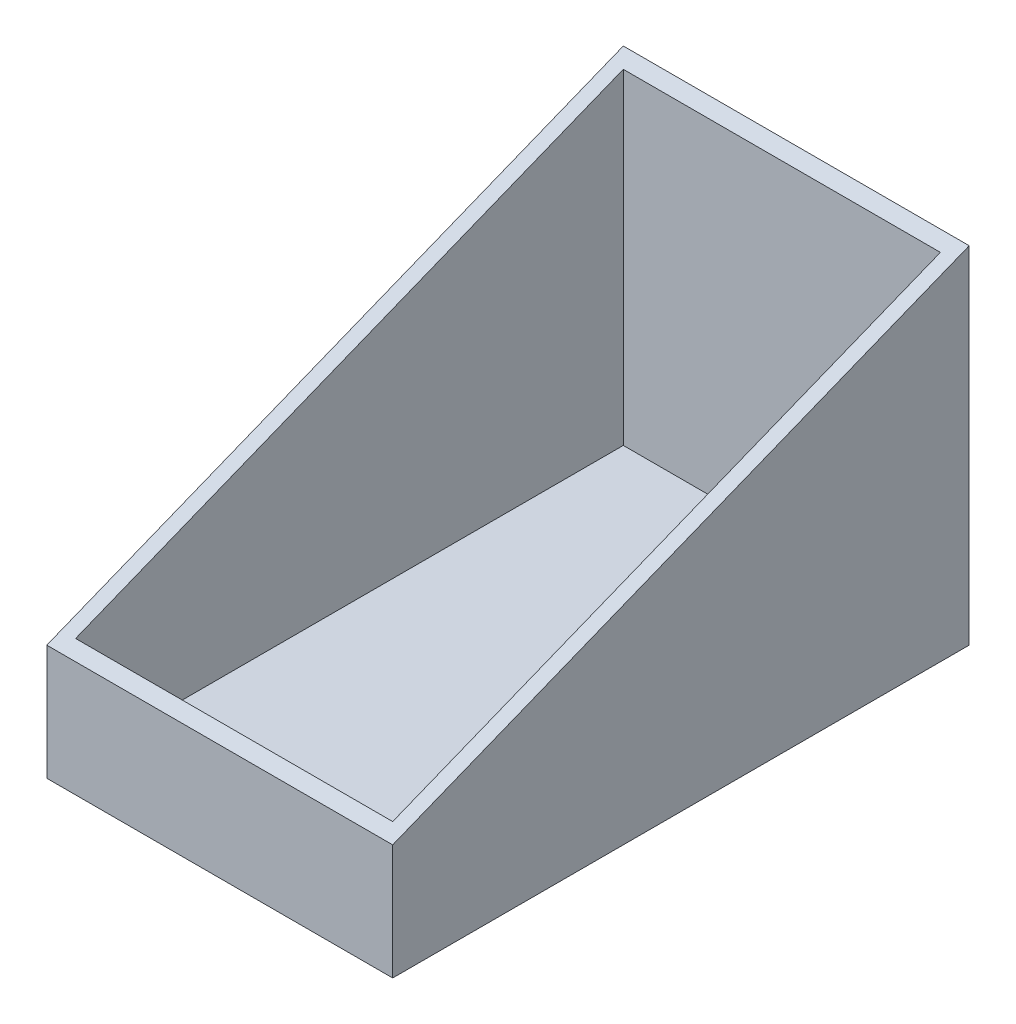
ISO-10303-21;
HEADER;
FILE_DESCRIPTION(('STEP AP214'),'2;1');
FILE_NAME('part.step','',(''),(''),'','','');
FILE_SCHEMA(('AUTOMOTIVE_DESIGN { 1 0 10303 214 1 1 1 1 }'));
ENDSEC;
DATA;
#1=APPLICATION_CONTEXT('core data for automotive mechanical design processes');
#2=APPLICATION_PROTOCOL_DEFINITION('international standard','automotive_design',2000,#1);
#3=PRODUCT_CONTEXT('',#1,'mechanical');
#4=PRODUCT('Part','Part','',(#3));
#5=PRODUCT_RELATED_PRODUCT_CATEGORY('part','',(#4));
#6=PRODUCT_DEFINITION_FORMATION('','',#4);
#7=PRODUCT_DEFINITION_CONTEXT('part definition',#1,'design');
#8=PRODUCT_DEFINITION('design','',#6,#7);
#9=PRODUCT_DEFINITION_SHAPE('','',#8);
#10=(LENGTH_UNIT() NAMED_UNIT(*) SI_UNIT(.MILLI.,.METRE.));
#11=(NAMED_UNIT(*) PLANE_ANGLE_UNIT() SI_UNIT($,.RADIAN.));
#12=(NAMED_UNIT(*) SI_UNIT($,.STERADIAN.) SOLID_ANGLE_UNIT());
#13=UNCERTAINTY_MEASURE_WITH_UNIT(LENGTH_MEASURE(1.E-05),#10,'distance_accuracy_value','');
#14=(GEOMETRIC_REPRESENTATION_CONTEXT(3) GLOBAL_UNCERTAINTY_ASSIGNED_CONTEXT((#13)) GLOBAL_UNIT_ASSIGNED_CONTEXT((#10,
#11,#12)) REPRESENTATION_CONTEXT('',''));
#15=CARTESIAN_POINT('',(0.,0.,0.));
#16=DIRECTION('',(0.,0.,1.));
#17=DIRECTION('',(1.,0.,0.));
#18=AXIS2_PLACEMENT_3D('',#15,#16,#17);
#19=CARTESIAN_POINT('',(152.4,43.7931034482759,17.5172413793103));
#20=DIRECTION('',(0.,-0.928476690885259,-0.371390676354104));
#21=DIRECTION('',(0.,0.371390676354104,-0.928476690885259));
#22=AXIS2_PLACEMENT_3D('',#19,#20,#21);
#23=PLANE('',#22);
#24=DIRECTION('',(0.,-0.371390676354104,0.928476690885259));
#25=VECTOR('',#24,1.);
#26=CARTESIAN_POINT('',(0.,43.7931034482759,17.5172413793103));
#27=LINE('',#26,#25);
#28=CARTESIAN_POINT('',(0.,152.4,-254.));
#29=VERTEX_POINT('',#28);
#30=CARTESIAN_POINT('',(0.,50.8,0.));
#31=VERTEX_POINT('',#30);
#32=EDGE_CURVE('E183',#29,#31,#27,.T.);
#33=ORIENTED_EDGE('',*,*,#32,.T.);
#34=DIRECTION('',(-1.,0.,0.));
#35=VECTOR('',#34,1.);
#36=CARTESIAN_POINT('',(152.4,50.8,0.));
#37=LINE('',#36,#35);
#38=CARTESIAN_POINT('',(152.4,50.8,0.));
#39=VERTEX_POINT('',#38);
#40=EDGE_CURVE('E192',#39,#31,#37,.T.);
#41=ORIENTED_EDGE('',*,*,#40,.F.);
#42=DIRECTION('',(0.,-0.371390676354104,0.928476690885259));
#43=VECTOR('',#42,1.);
#44=CARTESIAN_POINT('',(152.4,43.7931034482759,17.5172413793103));
#45=LINE('',#44,#43);
#46=CARTESIAN_POINT('',(152.4,152.4,-254.));
#47=VERTEX_POINT('',#46);
#48=EDGE_CURVE('E171',#47,#39,#45,.T.);
#49=ORIENTED_EDGE('',*,*,#48,.F.);
#50=DIRECTION('',(-1.,0.,0.));
#51=VECTOR('',#50,1.);
#52=CARTESIAN_POINT('',(152.4,152.4,-254.));
#53=LINE('',#52,#51);
#54=EDGE_CURVE('E54',#47,#29,#53,.T.);
#55=ORIENTED_EDGE('',*,*,#54,.T.);
#56=EDGE_LOOP('',(#33,#41,#49,#55));
#57=FACE_BOUND('',#56,.T.);
#58=DIRECTION('',(0.,-0.371390676354104,0.928476690885259));
#59=VECTOR('',#58,1.);
#60=CARTESIAN_POINT('',(6.34999999999999,43.7931034482759,17.5172413793103));
#61=LINE('',#60,#59);
#62=CARTESIAN_POINT('',(6.35,149.86,-247.65));
#63=VERTEX_POINT('',#62);
#64=CARTESIAN_POINT('',(6.35,53.34,-6.35));
#65=VERTEX_POINT('',#64);
#66=EDGE_CURVE('E145',#63,#65,#61,.T.);
#67=ORIENTED_EDGE('',*,*,#66,.F.);
#68=DIRECTION('',(-1.,0.,0.));
#69=VECTOR('',#68,1.);
#70=CARTESIAN_POINT('',(152.4,149.86,-247.65));
#71=LINE('',#70,#69);
#72=CARTESIAN_POINT('',(146.05,149.86,-247.65));
#73=VERTEX_POINT('',#72);
#74=EDGE_CURVE('E157',#73,#63,#71,.T.);
#75=ORIENTED_EDGE('',*,*,#74,.F.);
#76=DIRECTION('',(0.,-0.371390676354104,0.928476690885259));
#77=VECTOR('',#76,1.);
#78=CARTESIAN_POINT('',(146.05,43.7931034482759,17.5172413793103));
#79=LINE('',#78,#77);
#80=CARTESIAN_POINT('',(146.05,53.34,-6.35));
#81=VERTEX_POINT('',#80);
#82=EDGE_CURVE('E61',#73,#81,#79,.T.);
#83=ORIENTED_EDGE('',*,*,#82,.T.);
#84=DIRECTION('',(-1.,0.,0.));
#85=VECTOR('',#84,1.);
#86=CARTESIAN_POINT('',(152.4,53.34,-6.35));
#87=LINE('',#86,#85);
#88=EDGE_CURVE('E131',#81,#65,#87,.T.);
#89=ORIENTED_EDGE('',*,*,#88,.T.);
#90=EDGE_LOOP('',(#67,#75,#83,#89));
#91=FACE_BOUND('',#90,.T.);
#92=ADVANCED_FACE('F45',(#57,#91),#23,.F.);
#93=CARTESIAN_POINT('',(152.4,0.,0.));
#94=DIRECTION('',(0.,1.,0.));
#95=DIRECTION('',(0.,0.,1.));
#96=AXIS2_PLACEMENT_3D('',#93,#94,#95);
#97=PLANE('',#96);
#98=DIRECTION('',(0.,0.,-1.));
#99=VECTOR('',#98,1.);
#100=CARTESIAN_POINT('',(0.,0.,0.));
#101=LINE('',#100,#99);
#102=CARTESIAN_POINT('',(0.,0.,0.));
#103=VERTEX_POINT('',#102);
#104=CARTESIAN_POINT('',(0.,0.,-254.));
#105=VERTEX_POINT('',#104);
#106=EDGE_CURVE('E177',#103,#105,#101,.T.);
#107=ORIENTED_EDGE('',*,*,#106,.T.);
#108=DIRECTION('',(-1.,0.,0.));
#109=VECTOR('',#108,1.);
#110=CARTESIAN_POINT('',(152.4,0.,-254.));
#111=LINE('',#110,#109);
#112=CARTESIAN_POINT('',(152.4,0.,-254.));
#113=VERTEX_POINT('',#112);
#114=EDGE_CURVE('E11',#113,#105,#111,.T.);
#115=ORIENTED_EDGE('',*,*,#114,.F.);
#116=DIRECTION('',(0.,0.,-1.));
#117=VECTOR('',#116,1.);
#118=CARTESIAN_POINT('',(152.4,0.,0.));
#119=LINE('',#118,#117);
#120=CARTESIAN_POINT('',(152.4,0.,0.));
#121=VERTEX_POINT('',#120);
#122=EDGE_CURVE('E165',#121,#113,#119,.T.);
#123=ORIENTED_EDGE('',*,*,#122,.F.);
#124=DIRECTION('',(-1.,0.,0.));
#125=VECTOR('',#124,1.);
#126=CARTESIAN_POINT('',(152.4,0.,0.));
#127=LINE('',#126,#125);
#128=EDGE_CURVE('E70',#121,#103,#127,.T.);
#129=ORIENTED_EDGE('',*,*,#128,.T.);
#130=EDGE_LOOP('',(#107,#115,#123,#129));
#131=FACE_BOUND('',#130,.T.);
#132=ADVANCED_FACE('F47',(#131),#97,.F.);
#133=CARTESIAN_POINT('',(152.4,0.,-254.));
#134=DIRECTION('',(0.,0.,1.));
#135=DIRECTION('',(1.,0.,0.));
#136=AXIS2_PLACEMENT_3D('',#133,#134,#135);
#137=PLANE('',#136);
#138=DIRECTION('',(0.,1.,0.));
#139=VECTOR('',#138,1.);
#140=CARTESIAN_POINT('',(0.,0.,-254.));
#141=LINE('',#140,#139);
#142=EDGE_CURVE('E180',#105,#29,#141,.T.);
#143=ORIENTED_EDGE('',*,*,#142,.T.);
#144=ORIENTED_EDGE('',*,*,#54,.F.);
#145=DIRECTION('',(0.,1.,0.));
#146=VECTOR('',#145,1.);
#147=CARTESIAN_POINT('',(152.4,0.,-254.));
#148=LINE('',#147,#146);
#149=EDGE_CURVE('E96',#113,#47,#148,.T.);
#150=ORIENTED_EDGE('',*,*,#149,.F.);
#151=ORIENTED_EDGE('',*,*,#114,.T.);
#152=EDGE_LOOP('',(#143,#144,#150,#151));
#153=FACE_BOUND('',#152,.T.);
#154=ADVANCED_FACE('F208',(#153),#137,.F.);
#155=CARTESIAN_POINT('',(152.4,0.,0.));
#156=DIRECTION('',(0.,0.,1.));
#157=DIRECTION('',(1.,0.,0.));
#158=AXIS2_PLACEMENT_3D('',#155,#156,#157);
#159=PLANE('',#158);
#160=DIRECTION('',(0.,1.,0.));
#161=VECTOR('',#160,1.);
#162=CARTESIAN_POINT('',(0.,0.,0.));
#163=LINE('',#162,#161);
#164=EDGE_CURVE('E168',#103,#31,#163,.T.);
#165=ORIENTED_EDGE('',*,*,#164,.F.);
#166=ORIENTED_EDGE('',*,*,#128,.F.);
#167=DIRECTION('',(0.,1.,0.));
#168=VECTOR('',#167,1.);
#169=CARTESIAN_POINT('',(152.4,0.,0.));
#170=LINE('',#169,#168);
#171=EDGE_CURVE('E174',#121,#39,#170,.T.);
#172=ORIENTED_EDGE('',*,*,#171,.T.);
#173=ORIENTED_EDGE('',*,*,#40,.T.);
#174=EDGE_LOOP('',(#165,#166,#172,#173));
#175=FACE_BOUND('',#174,.T.);
#176=ADVANCED_FACE('F203',(#175),#159,.T.);
#177=CARTESIAN_POINT('',(152.4,0.,0.));
#178=DIRECTION('',(1.,0.,0.));
#179=DIRECTION('',(0.,0.,-1.));
#180=AXIS2_PLACEMENT_3D('',#177,#178,#179);
#181=PLANE('',#180);
#182=ORIENTED_EDGE('',*,*,#122,.T.);
#183=ORIENTED_EDGE('',*,*,#149,.T.);
#184=ORIENTED_EDGE('',*,*,#48,.T.);
#185=ORIENTED_EDGE('',*,*,#171,.F.);
#186=EDGE_LOOP('',(#182,#183,#184,#185));
#187=FACE_BOUND('',#186,.T.);
#188=ADVANCED_FACE('F206',(#187),#181,.T.);
#189=CARTESIAN_POINT('',(0.,0.,0.));
#190=DIRECTION('',(1.,0.,0.));
#191=DIRECTION('',(0.,0.,-1.));
#192=AXIS2_PLACEMENT_3D('',#189,#190,#191);
#193=PLANE('',#192);
#194=ORIENTED_EDGE('',*,*,#106,.F.);
#195=ORIENTED_EDGE('',*,*,#164,.T.);
#196=ORIENTED_EDGE('',*,*,#32,.F.);
#197=ORIENTED_EDGE('',*,*,#142,.F.);
#198=EDGE_LOOP('',(#194,#195,#196,#197));
#199=FACE_BOUND('',#198,.T.);
#200=ADVANCED_FACE('F202',(#199),#193,.F.);
#201=CARTESIAN_POINT('',(152.4,6.35,0.));
#202=DIRECTION('',(0.,1.,0.));
#203=DIRECTION('',(0.,0.,1.));
#204=AXIS2_PLACEMENT_3D('',#201,#202,#203);
#205=PLANE('',#204);
#206=DIRECTION('',(0.,0.,-1.));
#207=VECTOR('',#206,1.);
#208=CARTESIAN_POINT('',(6.34999999999999,6.35,0.));
#209=LINE('',#208,#207);
#210=CARTESIAN_POINT('',(6.35,6.35,-6.35));
#211=VERTEX_POINT('',#210);
#212=CARTESIAN_POINT('',(6.35,6.35,-247.65));
#213=VERTEX_POINT('',#212);
#214=EDGE_CURVE('E135',#211,#213,#209,.T.);
#215=ORIENTED_EDGE('',*,*,#214,.F.);
#216=DIRECTION('',(-1.,0.,0.));
#217=VECTOR('',#216,1.);
#218=CARTESIAN_POINT('',(152.4,6.35,-6.35));
#219=LINE('',#218,#217);
#220=CARTESIAN_POINT('',(146.05,6.35,-6.35));
#221=VERTEX_POINT('',#220);
#222=EDGE_CURVE('E120',#221,#211,#219,.T.);
#223=ORIENTED_EDGE('',*,*,#222,.F.);
#224=DIRECTION('',(0.,0.,-1.));
#225=VECTOR('',#224,1.);
#226=CARTESIAN_POINT('',(146.05,6.35,0.));
#227=LINE('',#226,#225);
#228=CARTESIAN_POINT('',(146.05,6.35,-247.65));
#229=VERTEX_POINT('',#228);
#230=EDGE_CURVE('E147',#221,#229,#227,.T.);
#231=ORIENTED_EDGE('',*,*,#230,.T.);
#232=DIRECTION('',(-1.,0.,0.));
#233=VECTOR('',#232,1.);
#234=CARTESIAN_POINT('',(152.4,6.35,-247.65));
#235=LINE('',#234,#233);
#236=EDGE_CURVE('E138',#229,#213,#235,.T.);
#237=ORIENTED_EDGE('',*,*,#236,.T.);
#238=EDGE_LOOP('',(#215,#223,#231,#237));
#239=FACE_BOUND('',#238,.T.);
#240=ADVANCED_FACE('F136',(#239),#205,.T.);
#241=CARTESIAN_POINT('',(152.4,0.,-247.65));
#242=DIRECTION('',(0.,0.,1.));
#243=DIRECTION('',(1.,0.,0.));
#244=AXIS2_PLACEMENT_3D('',#241,#242,#243);
#245=PLANE('',#244);
#246=DIRECTION('',(0.,1.,0.));
#247=VECTOR('',#246,1.);
#248=CARTESIAN_POINT('',(6.34999999999999,0.,-247.65));
#249=LINE('',#248,#247);
#250=EDGE_CURVE('E141',#213,#63,#249,.T.);
#251=ORIENTED_EDGE('',*,*,#250,.F.);
#252=ORIENTED_EDGE('',*,*,#236,.F.);
#253=DIRECTION('',(0.,1.,0.));
#254=VECTOR('',#253,1.);
#255=CARTESIAN_POINT('',(146.05,0.,-247.65));
#256=LINE('',#255,#254);
#257=EDGE_CURVE('E151',#229,#73,#256,.T.);
#258=ORIENTED_EDGE('',*,*,#257,.T.);
#259=ORIENTED_EDGE('',*,*,#74,.T.);
#260=EDGE_LOOP('',(#251,#252,#258,#259));
#261=FACE_BOUND('',#260,.T.);
#262=ADVANCED_FACE('F231',(#261),#245,.T.);
#263=CARTESIAN_POINT('',(152.4,0.,-6.35));
#264=DIRECTION('',(0.,0.,1.));
#265=DIRECTION('',(1.,0.,0.));
#266=AXIS2_PLACEMENT_3D('',#263,#264,#265);
#267=PLANE('',#266);
#268=DIRECTION('',(0.,1.,0.));
#269=VECTOR('',#268,1.);
#270=CARTESIAN_POINT('',(6.34999999999999,0.,-6.35));
#271=LINE('',#270,#269);
#272=EDGE_CURVE('E124',#211,#65,#271,.T.);
#273=ORIENTED_EDGE('',*,*,#272,.T.);
#274=ORIENTED_EDGE('',*,*,#88,.F.);
#275=DIRECTION('',(0.,1.,0.));
#276=VECTOR('',#275,1.);
#277=CARTESIAN_POINT('',(146.05,0.,-6.35));
#278=LINE('',#277,#276);
#279=EDGE_CURVE('E126',#221,#81,#278,.T.);
#280=ORIENTED_EDGE('',*,*,#279,.F.);
#281=ORIENTED_EDGE('',*,*,#222,.T.);
#282=EDGE_LOOP('',(#273,#274,#280,#281));
#283=FACE_BOUND('',#282,.T.);
#284=ADVANCED_FACE('F122',(#283),#267,.F.);
#285=CARTESIAN_POINT('',(146.05,0.,0.));
#286=DIRECTION('',(1.,0.,0.));
#287=DIRECTION('',(0.,0.,-1.));
#288=AXIS2_PLACEMENT_3D('',#285,#286,#287);
#289=PLANE('',#288);
#290=ORIENTED_EDGE('',*,*,#230,.F.);
#291=ORIENTED_EDGE('',*,*,#279,.T.);
#292=ORIENTED_EDGE('',*,*,#82,.F.);
#293=ORIENTED_EDGE('',*,*,#257,.F.);
#294=EDGE_LOOP('',(#290,#291,#292,#293));
#295=FACE_BOUND('',#294,.T.);
#296=ADVANCED_FACE('F226',(#295),#289,.F.);
#297=CARTESIAN_POINT('',(6.35,0.,0.));
#298=DIRECTION('',(1.,0.,0.));
#299=DIRECTION('',(0.,0.,-1.));
#300=AXIS2_PLACEMENT_3D('',#297,#298,#299);
#301=PLANE('',#300);
#302=ORIENTED_EDGE('',*,*,#214,.T.);
#303=ORIENTED_EDGE('',*,*,#250,.T.);
#304=ORIENTED_EDGE('',*,*,#66,.T.);
#305=ORIENTED_EDGE('',*,*,#272,.F.);
#306=EDGE_LOOP('',(#302,#303,#304,#305));
#307=FACE_BOUND('',#306,.T.);
#308=ADVANCED_FACE('F143',(#307),#301,.T.);
#309=CLOSED_SHELL('',(#92,#132,#154,#176,#188,#200,#240,#262,#284,#296,#308));
#310=MANIFOLD_SOLID_BREP('B2',#309);
#311=ADVANCED_BREP_SHAPE_REPRESENTATION('',(#18,#310),#14);
#312=SHAPE_DEFINITION_REPRESENTATION(#9,#311);
ENDSEC;
END-ISO-10303-21;
